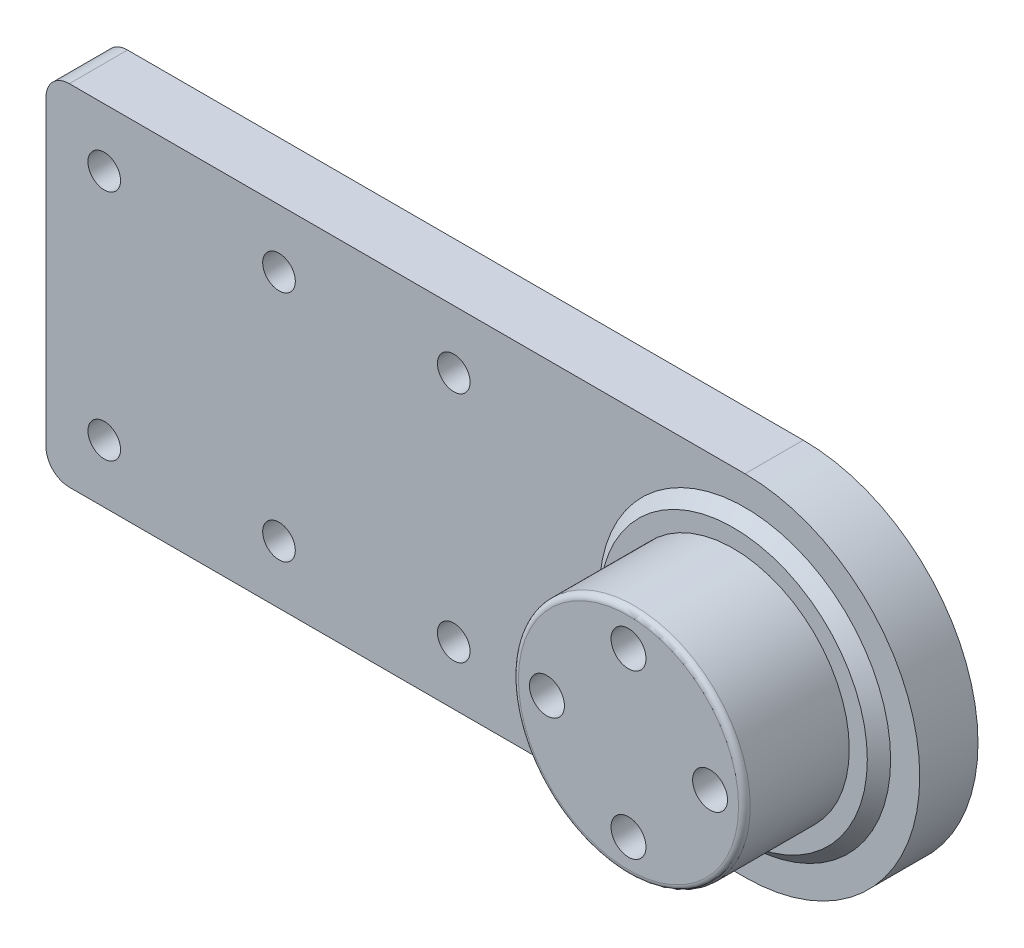
ISO-10303-21;
HEADER;
FILE_DESCRIPTION(('STEP AP214'),'2;1');
FILE_NAME('part.step','',(''),(''),'','','');
FILE_SCHEMA(('AUTOMOTIVE_DESIGN { 1 0 10303 214 1 1 1 1 }'));
ENDSEC;
DATA;
#1=APPLICATION_CONTEXT('core data for automotive mechanical design processes');
#2=APPLICATION_PROTOCOL_DEFINITION('international standard','automotive_design',2000,#1);
#3=PRODUCT_CONTEXT('',#1,'mechanical');
#4=PRODUCT('Part','Part','',(#3));
#5=PRODUCT_RELATED_PRODUCT_CATEGORY('part','',(#4));
#6=PRODUCT_DEFINITION_FORMATION('','',#4);
#7=PRODUCT_DEFINITION_CONTEXT('part definition',#1,'design');
#8=PRODUCT_DEFINITION('design','',#6,#7);
#9=PRODUCT_DEFINITION_SHAPE('','',#8);
#10=(LENGTH_UNIT() NAMED_UNIT(*) SI_UNIT(.MILLI.,.METRE.));
#11=(NAMED_UNIT(*) PLANE_ANGLE_UNIT() SI_UNIT($,.RADIAN.));
#12=(NAMED_UNIT(*) SI_UNIT($,.STERADIAN.) SOLID_ANGLE_UNIT());
#13=UNCERTAINTY_MEASURE_WITH_UNIT(LENGTH_MEASURE(1.E-05),#10,'distance_accuracy_value','');
#14=(GEOMETRIC_REPRESENTATION_CONTEXT(3) GLOBAL_UNCERTAINTY_ASSIGNED_CONTEXT((#13)) GLOBAL_UNIT_ASSIGNED_CONTEXT((#10,
#11,#12)) REPRESENTATION_CONTEXT('',''));
#15=CARTESIAN_POINT('',(0.,0.,0.));
#16=DIRECTION('',(0.,0.,1.));
#17=DIRECTION('',(1.,0.,0.));
#18=AXIS2_PLACEMENT_3D('',#15,#16,#17);
#19=CARTESIAN_POINT('',(0.,0.,0.));
#20=DIRECTION('',(0.,0.,1.));
#21=DIRECTION('',(1.,0.,0.));
#22=AXIS2_PLACEMENT_3D('',#19,#20,#21);
#23=CYLINDRICAL_SURFACE('',#22,9.95);
#24=CARTESIAN_POINT('',(0.,0.,1.5));
#25=DIRECTION('',(0.,0.,1.));
#26=DIRECTION('',(1.,0.,0.));
#27=AXIS2_PLACEMENT_3D('',#24,#25,#26);
#28=CIRCLE('',#27,9.95);
#29=CARTESIAN_POINT('',(9.95,0.,1.5));
#30=VERTEX_POINT('',#29);
#31=EDGE_CURVE('E11',#30,#30,#28,.F.);
#32=ORIENTED_EDGE('',*,*,#31,.T.);
#33=EDGE_LOOP('',(#32));
#34=FACE_BOUND('',#33,.T.);
#35=CARTESIAN_POINT('',(0.,0.,-7.));
#36=DIRECTION('',(0.,0.,1.));
#37=DIRECTION('',(1.,0.,0.));
#38=AXIS2_PLACEMENT_3D('',#35,#36,#37);
#39=CIRCLE('',#38,9.95);
#40=CARTESIAN_POINT('',(9.95,0.,-7.));
#41=VERTEX_POINT('',#40);
#42=EDGE_CURVE('E114',#41,#41,#39,.T.);
#43=ORIENTED_EDGE('',*,*,#42,.T.);
#44=EDGE_LOOP('',(#43));
#45=FACE_BOUND('',#44,.T.);
#46=ADVANCED_FACE('F37',(#34,#45),#23,.T.);
#47=CARTESIAN_POINT('',(0.,0.,-7.));
#48=DIRECTION('',(0.,0.,-1.));
#49=DIRECTION('',(-1.,0.,0.));
#50=AXIS2_PLACEMENT_3D('',#47,#48,#49);
#51=CONICAL_SURFACE('',#50,11.5,0.785398163397449);
#52=CARTESIAN_POINT('',(0.,0.,-8.));
#53=DIRECTION('',(0.,0.,1.));
#54=DIRECTION('',(1.,0.,0.));
#55=AXIS2_PLACEMENT_3D('',#52,#53,#54);
#56=CIRCLE('',#55,12.5);
#57=CARTESIAN_POINT('',(12.5,0.,-8.));
#58=VERTEX_POINT('',#57);
#59=EDGE_CURVE('E110',#58,#58,#56,.T.);
#60=ORIENTED_EDGE('',*,*,#59,.T.);
#61=EDGE_LOOP('',(#60));
#62=FACE_BOUND('',#61,.T.);
#63=CARTESIAN_POINT('',(0.,0.,-7.));
#64=DIRECTION('',(0.,0.,1.));
#65=DIRECTION('',(1.,0.,0.));
#66=AXIS2_PLACEMENT_3D('',#63,#64,#65);
#67=CIRCLE('',#66,11.5);
#68=CARTESIAN_POINT('',(11.5,0.,-7.));
#69=VERTEX_POINT('',#68);
#70=EDGE_CURVE('E121',#69,#69,#67,.T.);
#71=ORIENTED_EDGE('',*,*,#70,.F.);
#72=EDGE_LOOP('',(#71));
#73=FACE_BOUND('',#72,.T.);
#74=ADVANCED_FACE('F155',(#62,#73),#51,.T.);
#75=CARTESIAN_POINT('',(9.95,0.,-7.));
#76=DIRECTION('',(0.,0.,1.));
#77=DIRECTION('',(1.,0.,0.));
#78=AXIS2_PLACEMENT_3D('',#75,#76,#77);
#79=PLANE('',#78);
#80=ORIENTED_EDGE('',*,*,#70,.T.);
#81=EDGE_LOOP('',(#80));
#82=FACE_BOUND('',#81,.T.);
#83=ORIENTED_EDGE('',*,*,#42,.F.);
#84=EDGE_LOOP('',(#83));
#85=FACE_BOUND('',#84,.T.);
#86=ADVANCED_FACE('F163',(#82,#85),#79,.T.);
#87=CARTESIAN_POINT('',(0.,0.,-13.));
#88=DIRECTION('',(0.,0.,1.));
#89=DIRECTION('',(1.,0.,0.));
#90=AXIS2_PLACEMENT_3D('',#87,#88,#89);
#91=CYLINDRICAL_SURFACE('',#90,15.);
#92=CARTESIAN_POINT('',(0.,0.,-8.));
#93=DIRECTION('',(0.,0.,-1.));
#94=DIRECTION('',(-1.,0.,0.));
#95=AXIS2_PLACEMENT_3D('',#92,#93,#94);
#96=CIRCLE('',#95,15.);
#97=CARTESIAN_POINT('',(0.,15.,-8.));
#98=VERTEX_POINT('',#97);
#99=CARTESIAN_POINT('',(0.,-15.,-8.));
#100=VERTEX_POINT('',#99);
#101=EDGE_CURVE('E109',#98,#100,#96,.T.);
#102=ORIENTED_EDGE('',*,*,#101,.T.);
#103=DIRECTION('',(0.,0.,1.));
#104=VECTOR('',#103,1.);
#105=CARTESIAN_POINT('',(0.,-15.,-13.));
#106=LINE('',#105,#104);
#107=CARTESIAN_POINT('',(0.,-15.,-13.));
#108=VERTEX_POINT('',#107);
#109=EDGE_CURVE('E95',#108,#100,#106,.T.);
#110=ORIENTED_EDGE('',*,*,#109,.F.);
#111=CARTESIAN_POINT('',(0.,0.,-13.));
#112=DIRECTION('',(0.,0.,-1.));
#113=DIRECTION('',(-1.,0.,0.));
#114=AXIS2_PLACEMENT_3D('',#111,#112,#113);
#115=CIRCLE('',#114,15.);
#116=CARTESIAN_POINT('',(0.,15.,-13.));
#117=VERTEX_POINT('',#116);
#118=EDGE_CURVE('E99',#117,#108,#115,.T.);
#119=ORIENTED_EDGE('',*,*,#118,.F.);
#120=DIRECTION('',(0.,0.,1.));
#121=VECTOR('',#120,1.);
#122=CARTESIAN_POINT('',(0.,15.,-13.));
#123=LINE('',#122,#121);
#124=EDGE_CURVE('E111',#117,#98,#123,.T.);
#125=ORIENTED_EDGE('',*,*,#124,.T.);
#126=EDGE_LOOP('',(#102,#110,#119,#125));
#127=FACE_BOUND('',#126,.T.);
#128=ADVANCED_FACE('F107',(#127),#91,.T.);
#129=CARTESIAN_POINT('',(-60.,-15.,-13.));
#130=DIRECTION('',(0.,-1.,0.));
#131=DIRECTION('',(0.,0.,-1.));
#132=AXIS2_PLACEMENT_3D('',#129,#130,#131);
#133=PLANE('',#132);
#134=DIRECTION('',(1.,0.,0.));
#135=VECTOR('',#134,1.);
#136=CARTESIAN_POINT('',(-60.,-15.,-8.));
#137=LINE('',#136,#135);
#138=CARTESIAN_POINT('',(-58.,-15.,-8.));
#139=VERTEX_POINT('',#138);
#140=EDGE_CURVE('E189',#139,#100,#137,.T.);
#141=ORIENTED_EDGE('',*,*,#140,.F.);
#142=DIRECTION('',(0.,0.,1.));
#143=VECTOR('',#142,1.);
#144=CARTESIAN_POINT('',(-58.,-15.,-13.));
#145=LINE('',#144,#143);
#146=CARTESIAN_POINT('',(-58.,-15.,-13.));
#147=VERTEX_POINT('',#146);
#148=EDGE_CURVE('E60',#139,#147,#145,.F.);
#149=ORIENTED_EDGE('',*,*,#148,.T.);
#150=DIRECTION('',(1.,0.,0.));
#151=VECTOR('',#150,1.);
#152=CARTESIAN_POINT('',(-60.,-15.,-13.));
#153=LINE('',#152,#151);
#154=EDGE_CURVE('E91',#147,#108,#153,.T.);
#155=ORIENTED_EDGE('',*,*,#154,.T.);
#156=ORIENTED_EDGE('',*,*,#109,.T.);
#157=EDGE_LOOP('',(#141,#149,#155,#156));
#158=FACE_BOUND('',#157,.T.);
#159=ADVANCED_FACE('F93',(#158),#133,.T.);
#160=CARTESIAN_POINT('',(-60.,15.,-13.));
#161=DIRECTION('',(-1.,0.,0.));
#162=DIRECTION('',(0.,0.,1.));
#163=AXIS2_PLACEMENT_3D('',#160,#161,#162);
#164=PLANE('',#163);
#165=DIRECTION('',(0.,-1.,0.));
#166=VECTOR('',#165,1.);
#167=CARTESIAN_POINT('',(-60.,15.,-13.));
#168=LINE('',#167,#166);
#169=CARTESIAN_POINT('',(-60.,13.,-13.));
#170=VERTEX_POINT('',#169);
#171=CARTESIAN_POINT('',(-60.,-13.,-13.));
#172=VERTEX_POINT('',#171);
#173=EDGE_CURVE('E98',#170,#172,#168,.T.);
#174=ORIENTED_EDGE('',*,*,#173,.T.);
#175=DIRECTION('',(0.,0.,1.));
#176=VECTOR('',#175,1.);
#177=CARTESIAN_POINT('',(-60.,-13.,-13.));
#178=LINE('',#177,#176);
#179=CARTESIAN_POINT('',(-60.,-13.,-8.));
#180=VERTEX_POINT('',#179);
#181=EDGE_CURVE('E126',#172,#180,#178,.T.);
#182=ORIENTED_EDGE('',*,*,#181,.T.);
#183=DIRECTION('',(0.,-1.,0.));
#184=VECTOR('',#183,1.);
#185=CARTESIAN_POINT('',(-60.,15.,-8.));
#186=LINE('',#185,#184);
#187=CARTESIAN_POINT('',(-60.,13.,-8.));
#188=VERTEX_POINT('',#187);
#189=EDGE_CURVE('E192',#188,#180,#186,.T.);
#190=ORIENTED_EDGE('',*,*,#189,.F.);
#191=DIRECTION('',(0.,0.,1.));
#192=VECTOR('',#191,1.);
#193=CARTESIAN_POINT('',(-60.,13.,-13.));
#194=LINE('',#193,#192);
#195=EDGE_CURVE('E123',#188,#170,#194,.F.);
#196=ORIENTED_EDGE('',*,*,#195,.T.);
#197=EDGE_LOOP('',(#174,#182,#190,#196));
#198=FACE_BOUND('',#197,.T.);
#199=ADVANCED_FACE('F181',(#198),#164,.T.);
#200=CARTESIAN_POINT('',(0.,15.,-13.));
#201=DIRECTION('',(0.,1.,0.));
#202=DIRECTION('',(0.,0.,1.));
#203=AXIS2_PLACEMENT_3D('',#200,#201,#202);
#204=PLANE('',#203);
#205=DIRECTION('',(-1.,0.,0.));
#206=VECTOR('',#205,1.);
#207=CARTESIAN_POINT('',(0.,15.,-13.));
#208=LINE('',#207,#206);
#209=CARTESIAN_POINT('',(-58.,15.,-13.));
#210=VERTEX_POINT('',#209);
#211=EDGE_CURVE('E103',#117,#210,#208,.T.);
#212=ORIENTED_EDGE('',*,*,#211,.T.);
#213=DIRECTION('',(0.,0.,1.));
#214=VECTOR('',#213,1.);
#215=CARTESIAN_POINT('',(-58.,15.,-13.));
#216=LINE('',#215,#214);
#217=CARTESIAN_POINT('',(-58.,15.,-8.));
#218=VERTEX_POINT('',#217);
#219=EDGE_CURVE('E137',#210,#218,#216,.T.);
#220=ORIENTED_EDGE('',*,*,#219,.T.);
#221=DIRECTION('',(-1.,0.,0.));
#222=VECTOR('',#221,1.);
#223=CARTESIAN_POINT('',(0.,15.,-8.));
#224=LINE('',#223,#222);
#225=EDGE_CURVE('E105',#98,#218,#224,.T.);
#226=ORIENTED_EDGE('',*,*,#225,.F.);
#227=ORIENTED_EDGE('',*,*,#124,.F.);
#228=EDGE_LOOP('',(#212,#220,#226,#227));
#229=FACE_BOUND('',#228,.T.);
#230=ADVANCED_FACE('F198',(#229),#204,.T.);
#231=CARTESIAN_POINT('',(0.,0.,-13.));
#232=DIRECTION('',(0.,0.,-1.));
#233=DIRECTION('',(-1.,0.,0.));
#234=AXIS2_PLACEMENT_3D('',#231,#232,#233);
#235=PLANE('',#234);
#236=CARTESIAN_POINT('',(-25.,10.,-13.));
#237=DIRECTION('',(0.,0.,1.));
#238=DIRECTION('',(1.,0.,0.));
#239=AXIS2_PLACEMENT_3D('',#236,#237,#238);
#240=CIRCLE('',#239,1.4);
#241=CARTESIAN_POINT('',(-23.6,10.,-13.));
#242=VERTEX_POINT('',#241);
#243=EDGE_CURVE('E457',#242,#242,#240,.T.);
#244=ORIENTED_EDGE('',*,*,#243,.T.);
#245=EDGE_LOOP('',(#244));
#246=FACE_BOUND('',#245,.T.);
#247=CARTESIAN_POINT('',(-40.,-10.,-13.));
#248=DIRECTION('',(0.,0.,1.));
#249=DIRECTION('',(1.,0.,0.));
#250=AXIS2_PLACEMENT_3D('',#247,#248,#249);
#251=CIRCLE('',#250,1.4);
#252=CARTESIAN_POINT('',(-38.6,-10.,-13.));
#253=VERTEX_POINT('',#252);
#254=EDGE_CURVE('E439',#253,#253,#251,.T.);
#255=ORIENTED_EDGE('',*,*,#254,.T.);
#256=EDGE_LOOP('',(#255));
#257=FACE_BOUND('',#256,.T.);
#258=CARTESIAN_POINT('',(-40.,10.,-13.));
#259=DIRECTION('',(0.,0.,1.));
#260=DIRECTION('',(1.,0.,0.));
#261=AXIS2_PLACEMENT_3D('',#258,#259,#260);
#262=CIRCLE('',#261,1.4);
#263=CARTESIAN_POINT('',(-38.6,10.,-13.));
#264=VERTEX_POINT('',#263);
#265=EDGE_CURVE('E444',#264,#264,#262,.T.);
#266=ORIENTED_EDGE('',*,*,#265,.T.);
#267=EDGE_LOOP('',(#266));
#268=FACE_BOUND('',#267,.T.);
#269=CARTESIAN_POINT('',(-55.,-10.,-13.));
#270=DIRECTION('',(0.,0.,1.));
#271=DIRECTION('',(1.,0.,0.));
#272=AXIS2_PLACEMENT_3D('',#269,#270,#271);
#273=CIRCLE('',#272,1.4);
#274=CARTESIAN_POINT('',(-53.6,-10.,-13.));
#275=VERTEX_POINT('',#274);
#276=EDGE_CURVE('E465',#275,#275,#273,.T.);
#277=ORIENTED_EDGE('',*,*,#276,.T.);
#278=EDGE_LOOP('',(#277));
#279=FACE_BOUND('',#278,.T.);
#280=CARTESIAN_POINT('',(-25.,-10.,-13.));
#281=DIRECTION('',(0.,0.,1.));
#282=DIRECTION('',(1.,0.,0.));
#283=AXIS2_PLACEMENT_3D('',#280,#281,#282);
#284=CIRCLE('',#283,1.4);
#285=CARTESIAN_POINT('',(-23.6,-10.,-13.));
#286=VERTEX_POINT('',#285);
#287=EDGE_CURVE('E452',#286,#286,#284,.T.);
#288=ORIENTED_EDGE('',*,*,#287,.T.);
#289=EDGE_LOOP('',(#288));
#290=FACE_BOUND('',#289,.T.);
#291=CARTESIAN_POINT('',(-55.,10.,-13.));
#292=DIRECTION('',(0.,0.,1.));
#293=DIRECTION('',(1.,0.,0.));
#294=AXIS2_PLACEMENT_3D('',#291,#292,#293);
#295=CIRCLE('',#294,1.4);
#296=CARTESIAN_POINT('',(-53.6,10.,-13.));
#297=VERTEX_POINT('',#296);
#298=EDGE_CURVE('E470',#297,#297,#295,.T.);
#299=ORIENTED_EDGE('',*,*,#298,.T.);
#300=EDGE_LOOP('',(#299));
#301=FACE_BOUND('',#300,.T.);
#302=CARTESIAN_POINT('',(0.,7.,-13.));
#303=DIRECTION('',(0.,0.,1.));
#304=DIRECTION('',(1.,0.,0.));
#305=AXIS2_PLACEMENT_3D('',#302,#303,#304);
#306=CIRCLE('',#305,1.5);
#307=CARTESIAN_POINT('',(1.5,7.,-13.));
#308=VERTEX_POINT('',#307);
#309=EDGE_CURVE('E190',#308,#308,#306,.T.);
#310=ORIENTED_EDGE('',*,*,#309,.T.);
#311=EDGE_LOOP('',(#310));
#312=FACE_BOUND('',#311,.T.);
#313=CARTESIAN_POINT('',(7.,0.,-13.));
#314=DIRECTION('',(0.,0.,1.));
#315=DIRECTION('',(1.,0.,0.));
#316=AXIS2_PLACEMENT_3D('',#313,#314,#315);
#317=CIRCLE('',#316,1.5);
#318=CARTESIAN_POINT('',(8.5,0.,-13.));
#319=VERTEX_POINT('',#318);
#320=EDGE_CURVE('E484',#319,#319,#317,.T.);
#321=ORIENTED_EDGE('',*,*,#320,.T.);
#322=EDGE_LOOP('',(#321));
#323=FACE_BOUND('',#322,.T.);
#324=CARTESIAN_POINT('',(0.,-7.,-13.));
#325=DIRECTION('',(0.,0.,1.));
#326=DIRECTION('',(1.,0.,0.));
#327=AXIS2_PLACEMENT_3D('',#324,#325,#326);
#328=CIRCLE('',#327,1.5);
#329=CARTESIAN_POINT('',(1.5,-7.,-13.));
#330=VERTEX_POINT('',#329);
#331=EDGE_CURVE('E490',#330,#330,#328,.T.);
#332=ORIENTED_EDGE('',*,*,#331,.T.);
#333=EDGE_LOOP('',(#332));
#334=FACE_BOUND('',#333,.T.);
#335=CARTESIAN_POINT('',(-7.,0.,-13.));
#336=DIRECTION('',(0.,0.,1.));
#337=DIRECTION('',(1.,0.,0.));
#338=AXIS2_PLACEMENT_3D('',#335,#336,#337);
#339=CIRCLE('',#338,1.5);
#340=CARTESIAN_POINT('',(-5.5,0.,-13.));
#341=VERTEX_POINT('',#340);
#342=EDGE_CURVE('E473',#341,#341,#339,.T.);
#343=ORIENTED_EDGE('',*,*,#342,.T.);
#344=EDGE_LOOP('',(#343));
#345=FACE_BOUND('',#344,.T.);
#346=ORIENTED_EDGE('',*,*,#154,.F.);
#347=CARTESIAN_POINT('',(-58.,-13.,-13.));
#348=DIRECTION('',(0.,0.,-1.));
#349=DIRECTION('',(-1.,0.,0.));
#350=AXIS2_PLACEMENT_3D('',#347,#348,#349);
#351=CIRCLE('',#350,2.);
#352=EDGE_CURVE('E135',#147,#172,#351,.T.);
#353=ORIENTED_EDGE('',*,*,#352,.T.);
#354=ORIENTED_EDGE('',*,*,#173,.F.);
#355=CARTESIAN_POINT('',(-58.,13.,-13.));
#356=DIRECTION('',(0.,0.,-1.));
#357=DIRECTION('',(-1.,0.,0.));
#358=AXIS2_PLACEMENT_3D('',#355,#356,#357);
#359=CIRCLE('',#358,2.);
#360=EDGE_CURVE('E52',#170,#210,#359,.T.);
#361=ORIENTED_EDGE('',*,*,#360,.T.);
#362=ORIENTED_EDGE('',*,*,#211,.F.);
#363=ORIENTED_EDGE('',*,*,#118,.T.);
#364=EDGE_LOOP('',(#346,#353,#354,#361,#362,#363));
#365=FACE_BOUND('',#364,.T.);
#366=ADVANCED_FACE('F102',(#246,#257,#268,#279,#290,#301,#312,#323,#334,#345,#365),#235,.T.);
#367=CARTESIAN_POINT('',(0.,0.,-8.));
#368=DIRECTION('',(0.,0.,-1.));
#369=DIRECTION('',(-1.,0.,0.));
#370=AXIS2_PLACEMENT_3D('',#367,#368,#369);
#371=PLANE('',#370);
#372=CARTESIAN_POINT('',(-25.,10.,-8.));
#373=DIRECTION('',(0.,0.,1.));
#374=DIRECTION('',(1.,0.,0.));
#375=AXIS2_PLACEMENT_3D('',#372,#373,#374);
#376=CIRCLE('',#375,1.4);
#377=CARTESIAN_POINT('',(-23.6,10.,-8.));
#378=VERTEX_POINT('',#377);
#379=EDGE_CURVE('E449',#378,#378,#376,.T.);
#380=ORIENTED_EDGE('',*,*,#379,.F.);
#381=EDGE_LOOP('',(#380));
#382=FACE_BOUND('',#381,.T.);
#383=CARTESIAN_POINT('',(-40.,-10.,-8.));
#384=DIRECTION('',(0.,0.,1.));
#385=DIRECTION('',(1.,0.,0.));
#386=AXIS2_PLACEMENT_3D('',#383,#384,#385);
#387=CIRCLE('',#386,1.4);
#388=CARTESIAN_POINT('',(-38.6,-10.,-8.));
#389=VERTEX_POINT('',#388);
#390=EDGE_CURVE('E442',#389,#389,#387,.T.);
#391=ORIENTED_EDGE('',*,*,#390,.F.);
#392=EDGE_LOOP('',(#391));
#393=FACE_BOUND('',#392,.T.);
#394=CARTESIAN_POINT('',(-40.,10.,-8.));
#395=DIRECTION('',(0.,0.,1.));
#396=DIRECTION('',(1.,0.,0.));
#397=AXIS2_PLACEMENT_3D('',#394,#395,#396);
#398=CIRCLE('',#397,1.4);
#399=CARTESIAN_POINT('',(-38.6,10.,-8.));
#400=VERTEX_POINT('',#399);
#401=EDGE_CURVE('E447',#400,#400,#398,.T.);
#402=ORIENTED_EDGE('',*,*,#401,.F.);
#403=EDGE_LOOP('',(#402));
#404=FACE_BOUND('',#403,.T.);
#405=CARTESIAN_POINT('',(-55.,-10.,-8.));
#406=DIRECTION('',(0.,0.,1.));
#407=DIRECTION('',(1.,0.,0.));
#408=AXIS2_PLACEMENT_3D('',#405,#406,#407);
#409=CIRCLE('',#408,1.4);
#410=CARTESIAN_POINT('',(-53.6,-10.,-8.));
#411=VERTEX_POINT('',#410);
#412=EDGE_CURVE('E461',#411,#411,#409,.T.);
#413=ORIENTED_EDGE('',*,*,#412,.F.);
#414=EDGE_LOOP('',(#413));
#415=FACE_BOUND('',#414,.T.);
#416=CARTESIAN_POINT('',(-25.,-10.,-8.));
#417=DIRECTION('',(0.,0.,1.));
#418=DIRECTION('',(1.,0.,0.));
#419=AXIS2_PLACEMENT_3D('',#416,#417,#418);
#420=CIRCLE('',#419,1.4);
#421=CARTESIAN_POINT('',(-23.6,-10.,-8.));
#422=VERTEX_POINT('',#421);
#423=EDGE_CURVE('E460',#422,#422,#420,.T.);
#424=ORIENTED_EDGE('',*,*,#423,.F.);
#425=EDGE_LOOP('',(#424));
#426=FACE_BOUND('',#425,.T.);
#427=CARTESIAN_POINT('',(-55.,10.,-8.));
#428=DIRECTION('',(0.,0.,1.));
#429=DIRECTION('',(1.,0.,0.));
#430=AXIS2_PLACEMENT_3D('',#427,#428,#429);
#431=CIRCLE('',#430,1.4);
#432=CARTESIAN_POINT('',(-53.6,10.,-8.));
#433=VERTEX_POINT('',#432);
#434=EDGE_CURVE('E464',#433,#433,#431,.T.);
#435=ORIENTED_EDGE('',*,*,#434,.F.);
#436=EDGE_LOOP('',(#435));
#437=FACE_BOUND('',#436,.T.);
#438=ORIENTED_EDGE('',*,*,#59,.F.);
#439=EDGE_LOOP('',(#438));
#440=FACE_BOUND('',#439,.T.);
#441=ORIENTED_EDGE('',*,*,#189,.T.);
#442=CARTESIAN_POINT('',(-58.,-13.,-8.));
#443=DIRECTION('',(0.,0.,-1.));
#444=DIRECTION('',(-1.,0.,0.));
#445=AXIS2_PLACEMENT_3D('',#442,#443,#444);
#446=CIRCLE('',#445,2.);
#447=EDGE_CURVE('E131',#180,#139,#446,.F.);
#448=ORIENTED_EDGE('',*,*,#447,.T.);
#449=ORIENTED_EDGE('',*,*,#140,.T.);
#450=ORIENTED_EDGE('',*,*,#101,.F.);
#451=ORIENTED_EDGE('',*,*,#225,.T.);
#452=CARTESIAN_POINT('',(-58.,13.,-8.));
#453=DIRECTION('',(0.,0.,-1.));
#454=DIRECTION('',(-1.,0.,0.));
#455=AXIS2_PLACEMENT_3D('',#452,#453,#454);
#456=CIRCLE('',#455,2.);
#457=EDGE_CURVE('E129',#218,#188,#456,.F.);
#458=ORIENTED_EDGE('',*,*,#457,.T.);
#459=EDGE_LOOP('',(#441,#448,#449,#450,#451,#458));
#460=FACE_BOUND('',#459,.T.);
#461=ADVANCED_FACE('F196',(#382,#393,#404,#415,#426,#437,#440,#460),#371,.F.);
#462=CARTESIAN_POINT('',(0.,0.,2.));
#463=DIRECTION('',(0.,0.,1.));
#464=DIRECTION('',(1.,0.,0.));
#465=AXIS2_PLACEMENT_3D('',#462,#463,#464);
#466=PLANE('',#465);
#467=CARTESIAN_POINT('',(0.,0.,2.));
#468=DIRECTION('',(0.,0.,1.));
#469=DIRECTION('',(1.,0.,0.));
#470=AXIS2_PLACEMENT_3D('',#467,#468,#469);
#471=CIRCLE('',#470,9.45);
#472=CARTESIAN_POINT('',(9.45,0.,2.));
#473=VERTEX_POINT('',#472);
#474=EDGE_CURVE('E45',#473,#473,#471,.T.);
#475=ORIENTED_EDGE('',*,*,#474,.T.);
#476=EDGE_LOOP('',(#475));
#477=FACE_BOUND('',#476,.T.);
#478=CARTESIAN_POINT('',(0.,7.,2.));
#479=DIRECTION('',(0.,0.,1.));
#480=DIRECTION('',(1.,0.,0.));
#481=AXIS2_PLACEMENT_3D('',#478,#479,#480);
#482=CIRCLE('',#481,1.5);
#483=CARTESIAN_POINT('',(1.5,7.,2.));
#484=VERTEX_POINT('',#483);
#485=EDGE_CURVE('E478',#484,#484,#482,.T.);
#486=ORIENTED_EDGE('',*,*,#485,.F.);
#487=EDGE_LOOP('',(#486));
#488=FACE_BOUND('',#487,.T.);
#489=CARTESIAN_POINT('',(7.,0.,2.));
#490=DIRECTION('',(0.,0.,1.));
#491=DIRECTION('',(1.,0.,0.));
#492=AXIS2_PLACEMENT_3D('',#489,#490,#491);
#493=CIRCLE('',#492,1.5);
#494=CARTESIAN_POINT('',(8.5,0.,2.));
#495=VERTEX_POINT('',#494);
#496=EDGE_CURVE('E481',#495,#495,#493,.T.);
#497=ORIENTED_EDGE('',*,*,#496,.F.);
#498=EDGE_LOOP('',(#497));
#499=FACE_BOUND('',#498,.T.);
#500=CARTESIAN_POINT('',(0.,-7.,2.));
#501=DIRECTION('',(0.,0.,1.));
#502=DIRECTION('',(1.,0.,0.));
#503=AXIS2_PLACEMENT_3D('',#500,#501,#502);
#504=CIRCLE('',#503,1.5);
#505=CARTESIAN_POINT('',(1.5,-7.,2.));
#506=VERTEX_POINT('',#505);
#507=EDGE_CURVE('E487',#506,#506,#504,.T.);
#508=ORIENTED_EDGE('',*,*,#507,.F.);
#509=EDGE_LOOP('',(#508));
#510=FACE_BOUND('',#509,.T.);
#511=CARTESIAN_POINT('',(-7.,0.,2.));
#512=DIRECTION('',(0.,0.,1.));
#513=DIRECTION('',(1.,0.,0.));
#514=AXIS2_PLACEMENT_3D('',#511,#512,#513);
#515=CIRCLE('',#514,1.5);
#516=CARTESIAN_POINT('',(-5.5,0.,2.));
#517=VERTEX_POINT('',#516);
#518=EDGE_CURVE('E493',#517,#517,#515,.T.);
#519=ORIENTED_EDGE('',*,*,#518,.F.);
#520=EDGE_LOOP('',(#519));
#521=FACE_BOUND('',#520,.T.);
#522=ADVANCED_FACE('F142',(#477,#488,#499,#510,#521),#466,.T.);
#523=CARTESIAN_POINT('',(-7.,0.,-13.));
#524=DIRECTION('',(0.,0.,1.));
#525=DIRECTION('',(1.,0.,0.));
#526=AXIS2_PLACEMENT_3D('',#523,#524,#525);
#527=CYLINDRICAL_SURFACE('',#526,1.5);
#528=CARTESIAN_POINT('',(-5.5,0.,-13.));
#529=CARTESIAN_POINT('',(-5.5,0.,-12.84375));
#530=CARTESIAN_POINT('',(-5.5,0.,-12.6875));
#531=CARTESIAN_POINT('',(-5.5,0.,-12.375));
#532=CARTESIAN_POINT('',(-5.5,0.,-12.21875));
#533=CARTESIAN_POINT('',(-5.5,0.,-11.90625));
#534=CARTESIAN_POINT('',(-5.5,0.,-11.75));
#535=CARTESIAN_POINT('',(-5.5,0.,-11.4375));
#536=CARTESIAN_POINT('',(-5.5,0.,-11.28125));
#537=CARTESIAN_POINT('',(-5.5,0.,-10.96875));
#538=CARTESIAN_POINT('',(-5.5,0.,-10.8125));
#539=CARTESIAN_POINT('',(-5.5,0.,-10.5));
#540=CARTESIAN_POINT('',(-5.5,0.,-10.34375));
#541=CARTESIAN_POINT('',(-5.5,0.,-10.03125));
#542=CARTESIAN_POINT('',(-5.5,0.,-9.875));
#543=CARTESIAN_POINT('',(-5.5,0.,-9.5625));
#544=CARTESIAN_POINT('',(-5.5,0.,-9.40625));
#545=CARTESIAN_POINT('',(-5.5,0.,-9.09375));
#546=CARTESIAN_POINT('',(-5.5,0.,-8.9375));
#547=CARTESIAN_POINT('',(-5.5,0.,-8.625));
#548=CARTESIAN_POINT('',(-5.5,0.,-8.46875));
#549=CARTESIAN_POINT('',(-5.5,0.,-8.15625));
#550=CARTESIAN_POINT('',(-5.5,0.,-8.));
#551=CARTESIAN_POINT('',(-5.5,0.,-7.6875));
#552=CARTESIAN_POINT('',(-5.5,0.,-7.53125));
#553=CARTESIAN_POINT('',(-5.5,0.,-7.21875));
#554=CARTESIAN_POINT('',(-5.5,0.,-7.0625));
#555=CARTESIAN_POINT('',(-5.5,0.,-6.75));
#556=CARTESIAN_POINT('',(-5.5,0.,-6.59375));
#557=CARTESIAN_POINT('',(-5.5,0.,-6.28125));
#558=CARTESIAN_POINT('',(-5.5,0.,-6.125));
#559=CARTESIAN_POINT('',(-5.5,0.,-5.8125));
#560=CARTESIAN_POINT('',(-5.5,0.,-5.65625));
#561=CARTESIAN_POINT('',(-5.5,0.,-5.34375));
#562=CARTESIAN_POINT('',(-5.5,0.,-5.1875));
#563=CARTESIAN_POINT('',(-5.5,0.,-4.875));
#564=CARTESIAN_POINT('',(-5.5,0.,-4.71875));
#565=CARTESIAN_POINT('',(-5.5,0.,-4.40625));
#566=CARTESIAN_POINT('',(-5.5,0.,-4.25));
#567=CARTESIAN_POINT('',(-5.5,0.,-3.9375));
#568=CARTESIAN_POINT('',(-5.5,0.,-3.78125));
#569=CARTESIAN_POINT('',(-5.5,0.,-3.46875));
#570=CARTESIAN_POINT('',(-5.5,0.,-3.3125));
#571=CARTESIAN_POINT('',(-5.5,0.,-3.));
#572=CARTESIAN_POINT('',(-5.5,0.,-2.84375));
#573=CARTESIAN_POINT('',(-5.5,0.,-2.53125));
#574=CARTESIAN_POINT('',(-5.5,0.,-2.375));
#575=CARTESIAN_POINT('',(-5.5,0.,-2.0625));
#576=CARTESIAN_POINT('',(-5.5,0.,-1.90625));
#577=CARTESIAN_POINT('',(-5.5,0.,-1.59375));
#578=CARTESIAN_POINT('',(-5.5,0.,-1.4375));
#579=CARTESIAN_POINT('',(-5.5,0.,-1.125));
#580=CARTESIAN_POINT('',(-5.5,0.,-0.968750000000001));
#581=CARTESIAN_POINT('',(-5.5,0.,-0.656250000000001));
#582=CARTESIAN_POINT('',(-5.5,0.,-0.5));
#583=CARTESIAN_POINT('',(-5.5,0.,-0.1875));
#584=CARTESIAN_POINT('',(-5.5,0.,-0.03125));
#585=CARTESIAN_POINT('',(-5.5,0.,0.28125));
#586=CARTESIAN_POINT('',(-5.5,0.,0.437499999999999));
#587=CARTESIAN_POINT('',(-5.5,0.,0.749999999999999));
#588=CARTESIAN_POINT('',(-5.5,0.,0.906249999999999));
#589=CARTESIAN_POINT('',(-5.5,0.,1.21875));
#590=CARTESIAN_POINT('',(-5.5,0.,1.375));
#591=CARTESIAN_POINT('',(-5.5,0.,1.6875));
#592=CARTESIAN_POINT('',(-5.5,0.,1.84375));
#593=CARTESIAN_POINT('',(-5.5,0.,2.));
#594=B_SPLINE_CURVE_WITH_KNOTS('',3,(#528,#529,#530,#531,#532,#533,#534,#535,#536,#537,#538,
#539,#540,#541,#542,#543,#544,#545,#546,#547,#548,#549,#550,#551,#552,#553,#554,#555,#556,#557,
#558,#559,#560,#561,#562,#563,#564,#565,#566,#567,#568,#569,#570,#571,#572,#573,#574,#575,#576,
#577,#578,#579,#580,#581,#582,#583,#584,#585,#586,#587,#588,#589,#590,#591,#592,#593),
.UNSPECIFIED.,.F.,.F.,(4,2,2,2,2,2,2,2,2,2,2,2,2,2,2,2,2,2,2,2,2,2,2,2,2,2,2,2,2,2,2,2,4),(0.,
0.46875,0.937500000000001,1.40625,1.875,2.34375,2.8125,3.28125,3.75,4.21875,4.6875,5.15625,
5.625,6.09375,6.5625,7.03125,7.5,7.96875,8.4375,8.90625,9.375,9.84375,10.3125,10.78125,11.25,
11.71875,12.1875,12.65625,13.125,13.59375,14.0625,14.53125,15.),.UNSPECIFIED.);
#595=EDGE_CURVE('BSEAM286',#341,#517,#594,.T.);
#596=ORIENTED_EDGE('',*,*,#342,.F.);
#597=ORIENTED_EDGE('',*,*,#518,.T.);
#598=ORIENTED_EDGE('',*,*,#595,.T.);
#599=ORIENTED_EDGE('',*,*,#595,.F.);
#600=EDGE_LOOP('',(#596,#598,#597,#599));
#601=FACE_BOUND('',#600,.T.);
#602=ADVANCED_FACE('F286',(#601),#527,.F.);
#603=CARTESIAN_POINT('',(0.,-7.,-13.));
#604=DIRECTION('',(0.,0.,1.));
#605=DIRECTION('',(1.,0.,0.));
#606=AXIS2_PLACEMENT_3D('',#603,#604,#605);
#607=CYLINDRICAL_SURFACE('',#606,1.5);
#608=CARTESIAN_POINT('',(1.5,-7.,-13.));
#609=CARTESIAN_POINT('',(1.5,-7.,-12.84375));
#610=CARTESIAN_POINT('',(1.5,-7.,-12.6875));
#611=CARTESIAN_POINT('',(1.5,-7.,-12.375));
#612=CARTESIAN_POINT('',(1.5,-7.,-12.21875));
#613=CARTESIAN_POINT('',(1.5,-7.,-11.90625));
#614=CARTESIAN_POINT('',(1.5,-7.,-11.75));
#615=CARTESIAN_POINT('',(1.5,-7.,-11.4375));
#616=CARTESIAN_POINT('',(1.5,-7.,-11.28125));
#617=CARTESIAN_POINT('',(1.5,-7.,-10.96875));
#618=CARTESIAN_POINT('',(1.5,-7.,-10.8125));
#619=CARTESIAN_POINT('',(1.5,-7.,-10.5));
#620=CARTESIAN_POINT('',(1.5,-7.,-10.34375));
#621=CARTESIAN_POINT('',(1.5,-7.,-10.03125));
#622=CARTESIAN_POINT('',(1.5,-7.,-9.875));
#623=CARTESIAN_POINT('',(1.5,-7.,-9.5625));
#624=CARTESIAN_POINT('',(1.5,-7.,-9.40625));
#625=CARTESIAN_POINT('',(1.5,-7.,-9.09375));
#626=CARTESIAN_POINT('',(1.5,-7.,-8.9375));
#627=CARTESIAN_POINT('',(1.5,-7.,-8.625));
#628=CARTESIAN_POINT('',(1.5,-7.,-8.46875));
#629=CARTESIAN_POINT('',(1.5,-7.,-8.15625));
#630=CARTESIAN_POINT('',(1.5,-7.,-8.));
#631=CARTESIAN_POINT('',(1.5,-7.,-7.6875));
#632=CARTESIAN_POINT('',(1.5,-7.,-7.53125));
#633=CARTESIAN_POINT('',(1.5,-7.,-7.21875));
#634=CARTESIAN_POINT('',(1.5,-7.,-7.0625));
#635=CARTESIAN_POINT('',(1.5,-7.,-6.75));
#636=CARTESIAN_POINT('',(1.5,-7.,-6.59375));
#637=CARTESIAN_POINT('',(1.5,-7.,-6.28125));
#638=CARTESIAN_POINT('',(1.5,-7.,-6.125));
#639=CARTESIAN_POINT('',(1.5,-7.,-5.8125));
#640=CARTESIAN_POINT('',(1.5,-7.,-5.65625));
#641=CARTESIAN_POINT('',(1.5,-7.,-5.34375));
#642=CARTESIAN_POINT('',(1.5,-7.,-5.1875));
#643=CARTESIAN_POINT('',(1.5,-7.,-4.875));
#644=CARTESIAN_POINT('',(1.5,-7.,-4.71875));
#645=CARTESIAN_POINT('',(1.5,-7.,-4.40625));
#646=CARTESIAN_POINT('',(1.5,-7.,-4.25));
#647=CARTESIAN_POINT('',(1.5,-7.,-3.9375));
#648=CARTESIAN_POINT('',(1.5,-7.,-3.78125));
#649=CARTESIAN_POINT('',(1.5,-7.,-3.46875));
#650=CARTESIAN_POINT('',(1.5,-7.,-3.3125));
#651=CARTESIAN_POINT('',(1.5,-7.,-3.));
#652=CARTESIAN_POINT('',(1.5,-7.,-2.84375));
#653=CARTESIAN_POINT('',(1.5,-7.,-2.53125));
#654=CARTESIAN_POINT('',(1.5,-7.,-2.375));
#655=CARTESIAN_POINT('',(1.5,-7.,-2.0625));
#656=CARTESIAN_POINT('',(1.5,-7.,-1.90625));
#657=CARTESIAN_POINT('',(1.5,-7.,-1.59375));
#658=CARTESIAN_POINT('',(1.5,-7.,-1.4375));
#659=CARTESIAN_POINT('',(1.5,-7.,-1.125));
#660=CARTESIAN_POINT('',(1.5,-7.,-0.968750000000001));
#661=CARTESIAN_POINT('',(1.5,-7.,-0.656250000000001));
#662=CARTESIAN_POINT('',(1.5,-7.,-0.5));
#663=CARTESIAN_POINT('',(1.5,-7.,-0.1875));
#664=CARTESIAN_POINT('',(1.5,-7.,-0.03125));
#665=CARTESIAN_POINT('',(1.5,-7.,0.28125));
#666=CARTESIAN_POINT('',(1.5,-7.,0.437499999999999));
#667=CARTESIAN_POINT('',(1.5,-7.,0.749999999999999));
#668=CARTESIAN_POINT('',(1.5,-7.,0.906249999999999));
#669=CARTESIAN_POINT('',(1.5,-7.,1.21875));
#670=CARTESIAN_POINT('',(1.5,-7.,1.375));
#671=CARTESIAN_POINT('',(1.5,-7.,1.6875));
#672=CARTESIAN_POINT('',(1.5,-7.,1.84375));
#673=CARTESIAN_POINT('',(1.5,-7.,2.));
#674=B_SPLINE_CURVE_WITH_KNOTS('',3,(#608,#609,#610,#611,#612,#613,#614,#615,#616,#617,#618,
#619,#620,#621,#622,#623,#624,#625,#626,#627,#628,#629,#630,#631,#632,#633,#634,#635,#636,#637,
#638,#639,#640,#641,#642,#643,#644,#645,#646,#647,#648,#649,#650,#651,#652,#653,#654,#655,#656,
#657,#658,#659,#660,#661,#662,#663,#664,#665,#666,#667,#668,#669,#670,#671,#672,#673),
.UNSPECIFIED.,.F.,.F.,(4,2,2,2,2,2,2,2,2,2,2,2,2,2,2,2,2,2,2,2,2,2,2,2,2,2,2,2,2,2,2,2,4),(0.,
0.46875,0.937500000000001,1.40625,1.875,2.34375,2.8125,3.28125,3.75,4.21875,4.6875,5.15625,
5.625,6.09375,6.5625,7.03125,7.5,7.96875,8.4375,8.90625,9.375,9.84375,10.3125,10.78125,11.25,
11.71875,12.1875,12.65625,13.125,13.59375,14.0625,14.53125,15.),.UNSPECIFIED.);
#675=EDGE_CURVE('BSEAM297',#330,#506,#674,.T.);
#676=ORIENTED_EDGE('',*,*,#331,.F.);
#677=ORIENTED_EDGE('',*,*,#507,.T.);
#678=ORIENTED_EDGE('',*,*,#675,.T.);
#679=ORIENTED_EDGE('',*,*,#675,.F.);
#680=EDGE_LOOP('',(#676,#678,#677,#679));
#681=FACE_BOUND('',#680,.T.);
#682=ADVANCED_FACE('F297',(#681),#607,.F.);
#683=CARTESIAN_POINT('',(7.,0.,-13.));
#684=DIRECTION('',(0.,0.,1.));
#685=DIRECTION('',(1.,0.,0.));
#686=AXIS2_PLACEMENT_3D('',#683,#684,#685);
#687=CYLINDRICAL_SURFACE('',#686,1.5);
#688=CARTESIAN_POINT('',(8.5,0.,-13.));
#689=CARTESIAN_POINT('',(8.5,0.,-12.84375));
#690=CARTESIAN_POINT('',(8.5,0.,-12.6875));
#691=CARTESIAN_POINT('',(8.5,0.,-12.375));
#692=CARTESIAN_POINT('',(8.5,0.,-12.21875));
#693=CARTESIAN_POINT('',(8.5,0.,-11.90625));
#694=CARTESIAN_POINT('',(8.5,0.,-11.75));
#695=CARTESIAN_POINT('',(8.5,0.,-11.4375));
#696=CARTESIAN_POINT('',(8.5,0.,-11.28125));
#697=CARTESIAN_POINT('',(8.5,0.,-10.96875));
#698=CARTESIAN_POINT('',(8.5,0.,-10.8125));
#699=CARTESIAN_POINT('',(8.5,0.,-10.5));
#700=CARTESIAN_POINT('',(8.5,0.,-10.34375));
#701=CARTESIAN_POINT('',(8.5,0.,-10.03125));
#702=CARTESIAN_POINT('',(8.5,0.,-9.875));
#703=CARTESIAN_POINT('',(8.5,0.,-9.5625));
#704=CARTESIAN_POINT('',(8.5,0.,-9.40625));
#705=CARTESIAN_POINT('',(8.5,0.,-9.09375));
#706=CARTESIAN_POINT('',(8.5,0.,-8.9375));
#707=CARTESIAN_POINT('',(8.5,0.,-8.625));
#708=CARTESIAN_POINT('',(8.5,0.,-8.46875));
#709=CARTESIAN_POINT('',(8.5,0.,-8.15625));
#710=CARTESIAN_POINT('',(8.5,0.,-8.));
#711=CARTESIAN_POINT('',(8.5,0.,-7.6875));
#712=CARTESIAN_POINT('',(8.5,0.,-7.53125));
#713=CARTESIAN_POINT('',(8.5,0.,-7.21875));
#714=CARTESIAN_POINT('',(8.5,0.,-7.0625));
#715=CARTESIAN_POINT('',(8.5,0.,-6.75));
#716=CARTESIAN_POINT('',(8.5,0.,-6.59375));
#717=CARTESIAN_POINT('',(8.5,0.,-6.28125));
#718=CARTESIAN_POINT('',(8.5,0.,-6.125));
#719=CARTESIAN_POINT('',(8.5,0.,-5.8125));
#720=CARTESIAN_POINT('',(8.5,0.,-5.65625));
#721=CARTESIAN_POINT('',(8.5,0.,-5.34375));
#722=CARTESIAN_POINT('',(8.5,0.,-5.1875));
#723=CARTESIAN_POINT('',(8.5,0.,-4.875));
#724=CARTESIAN_POINT('',(8.5,0.,-4.71875));
#725=CARTESIAN_POINT('',(8.5,0.,-4.40625));
#726=CARTESIAN_POINT('',(8.5,0.,-4.25));
#727=CARTESIAN_POINT('',(8.5,0.,-3.9375));
#728=CARTESIAN_POINT('',(8.5,0.,-3.78125));
#729=CARTESIAN_POINT('',(8.5,0.,-3.46875));
#730=CARTESIAN_POINT('',(8.5,0.,-3.3125));
#731=CARTESIAN_POINT('',(8.5,0.,-3.));
#732=CARTESIAN_POINT('',(8.5,0.,-2.84375));
#733=CARTESIAN_POINT('',(8.5,0.,-2.53125));
#734=CARTESIAN_POINT('',(8.5,0.,-2.375));
#735=CARTESIAN_POINT('',(8.5,0.,-2.0625));
#736=CARTESIAN_POINT('',(8.5,0.,-1.90625));
#737=CARTESIAN_POINT('',(8.5,0.,-1.59375));
#738=CARTESIAN_POINT('',(8.5,0.,-1.4375));
#739=CARTESIAN_POINT('',(8.5,0.,-1.125));
#740=CARTESIAN_POINT('',(8.5,0.,-0.968750000000001));
#741=CARTESIAN_POINT('',(8.5,0.,-0.656250000000001));
#742=CARTESIAN_POINT('',(8.5,0.,-0.5));
#743=CARTESIAN_POINT('',(8.5,0.,-0.1875));
#744=CARTESIAN_POINT('',(8.5,0.,-0.03125));
#745=CARTESIAN_POINT('',(8.5,0.,0.28125));
#746=CARTESIAN_POINT('',(8.5,0.,0.437499999999999));
#747=CARTESIAN_POINT('',(8.5,0.,0.749999999999999));
#748=CARTESIAN_POINT('',(8.5,0.,0.906249999999999));
#749=CARTESIAN_POINT('',(8.5,0.,1.21875));
#750=CARTESIAN_POINT('',(8.5,0.,1.375));
#751=CARTESIAN_POINT('',(8.5,0.,1.6875));
#752=CARTESIAN_POINT('',(8.5,0.,1.84375));
#753=CARTESIAN_POINT('',(8.5,0.,2.));
#754=B_SPLINE_CURVE_WITH_KNOTS('',3,(#688,#689,#690,#691,#692,#693,#694,#695,#696,#697,#698,
#699,#700,#701,#702,#703,#704,#705,#706,#707,#708,#709,#710,#711,#712,#713,#714,#715,#716,#717,
#718,#719,#720,#721,#722,#723,#724,#725,#726,#727,#728,#729,#730,#731,#732,#733,#734,#735,#736,
#737,#738,#739,#740,#741,#742,#743,#744,#745,#746,#747,#748,#749,#750,#751,#752,#753),
.UNSPECIFIED.,.F.,.F.,(4,2,2,2,2,2,2,2,2,2,2,2,2,2,2,2,2,2,2,2,2,2,2,2,2,2,2,2,2,2,2,2,4),(0.,
0.46875,0.937500000000001,1.40625,1.875,2.34375,2.8125,3.28125,3.75,4.21875,4.6875,5.15625,
5.625,6.09375,6.5625,7.03125,7.5,7.96875,8.4375,8.90625,9.375,9.84375,10.3125,10.78125,11.25,
11.71875,12.1875,12.65625,13.125,13.59375,14.0625,14.53125,15.),.UNSPECIFIED.);
#755=EDGE_CURVE('BSEAM304',#319,#495,#754,.T.);
#756=ORIENTED_EDGE('',*,*,#320,.F.);
#757=ORIENTED_EDGE('',*,*,#496,.T.);
#758=ORIENTED_EDGE('',*,*,#755,.T.);
#759=ORIENTED_EDGE('',*,*,#755,.F.);
#760=EDGE_LOOP('',(#756,#758,#757,#759));
#761=FACE_BOUND('',#760,.T.);
#762=ADVANCED_FACE('F304',(#761),#687,.F.);
#763=CARTESIAN_POINT('',(0.,7.,-13.));
#764=DIRECTION('',(0.,0.,1.));
#765=DIRECTION('',(1.,0.,0.));
#766=AXIS2_PLACEMENT_3D('',#763,#764,#765);
#767=CYLINDRICAL_SURFACE('',#766,1.5);
#768=CARTESIAN_POINT('',(1.5,7.,-13.));
#769=CARTESIAN_POINT('',(1.5,7.,-12.84375));
#770=CARTESIAN_POINT('',(1.5,7.,-12.6875));
#771=CARTESIAN_POINT('',(1.5,7.,-12.375));
#772=CARTESIAN_POINT('',(1.5,7.,-12.21875));
#773=CARTESIAN_POINT('',(1.5,7.,-11.90625));
#774=CARTESIAN_POINT('',(1.5,7.,-11.75));
#775=CARTESIAN_POINT('',(1.5,7.,-11.4375));
#776=CARTESIAN_POINT('',(1.5,7.,-11.28125));
#777=CARTESIAN_POINT('',(1.5,7.,-10.96875));
#778=CARTESIAN_POINT('',(1.5,7.,-10.8125));
#779=CARTESIAN_POINT('',(1.5,7.,-10.5));
#780=CARTESIAN_POINT('',(1.5,7.,-10.34375));
#781=CARTESIAN_POINT('',(1.5,7.,-10.03125));
#782=CARTESIAN_POINT('',(1.5,7.,-9.875));
#783=CARTESIAN_POINT('',(1.5,7.,-9.5625));
#784=CARTESIAN_POINT('',(1.5,7.,-9.40625));
#785=CARTESIAN_POINT('',(1.5,7.,-9.09375));
#786=CARTESIAN_POINT('',(1.5,7.,-8.9375));
#787=CARTESIAN_POINT('',(1.5,7.,-8.625));
#788=CARTESIAN_POINT('',(1.5,7.,-8.46875));
#789=CARTESIAN_POINT('',(1.5,7.,-8.15625));
#790=CARTESIAN_POINT('',(1.5,7.,-8.));
#791=CARTESIAN_POINT('',(1.5,7.,-7.6875));
#792=CARTESIAN_POINT('',(1.5,7.,-7.53125));
#793=CARTESIAN_POINT('',(1.5,7.,-7.21875));
#794=CARTESIAN_POINT('',(1.5,7.,-7.0625));
#795=CARTESIAN_POINT('',(1.5,7.,-6.75));
#796=CARTESIAN_POINT('',(1.5,7.,-6.59375));
#797=CARTESIAN_POINT('',(1.5,7.,-6.28125));
#798=CARTESIAN_POINT('',(1.5,7.,-6.125));
#799=CARTESIAN_POINT('',(1.5,7.,-5.8125));
#800=CARTESIAN_POINT('',(1.5,7.,-5.65625));
#801=CARTESIAN_POINT('',(1.5,7.,-5.34375));
#802=CARTESIAN_POINT('',(1.5,7.,-5.1875));
#803=CARTESIAN_POINT('',(1.5,7.,-4.875));
#804=CARTESIAN_POINT('',(1.5,7.,-4.71875));
#805=CARTESIAN_POINT('',(1.5,7.,-4.40625));
#806=CARTESIAN_POINT('',(1.5,7.,-4.25));
#807=CARTESIAN_POINT('',(1.5,7.,-3.9375));
#808=CARTESIAN_POINT('',(1.5,7.,-3.78125));
#809=CARTESIAN_POINT('',(1.5,7.,-3.46875));
#810=CARTESIAN_POINT('',(1.5,7.,-3.3125));
#811=CARTESIAN_POINT('',(1.5,7.,-3.));
#812=CARTESIAN_POINT('',(1.5,7.,-2.84375));
#813=CARTESIAN_POINT('',(1.5,7.,-2.53125));
#814=CARTESIAN_POINT('',(1.5,7.,-2.375));
#815=CARTESIAN_POINT('',(1.5,7.,-2.0625));
#816=CARTESIAN_POINT('',(1.5,7.,-1.90625));
#817=CARTESIAN_POINT('',(1.5,7.,-1.59375));
#818=CARTESIAN_POINT('',(1.5,7.,-1.4375));
#819=CARTESIAN_POINT('',(1.5,7.,-1.125));
#820=CARTESIAN_POINT('',(1.5,7.,-0.968750000000001));
#821=CARTESIAN_POINT('',(1.5,7.,-0.656250000000001));
#822=CARTESIAN_POINT('',(1.5,7.,-0.5));
#823=CARTESIAN_POINT('',(1.5,7.,-0.1875));
#824=CARTESIAN_POINT('',(1.5,7.,-0.03125));
#825=CARTESIAN_POINT('',(1.5,7.,0.28125));
#826=CARTESIAN_POINT('',(1.5,7.,0.437499999999999));
#827=CARTESIAN_POINT('',(1.5,7.,0.749999999999999));
#828=CARTESIAN_POINT('',(1.5,7.,0.906249999999999));
#829=CARTESIAN_POINT('',(1.5,7.,1.21875));
#830=CARTESIAN_POINT('',(1.5,7.,1.375));
#831=CARTESIAN_POINT('',(1.5,7.,1.6875));
#832=CARTESIAN_POINT('',(1.5,7.,1.84375));
#833=CARTESIAN_POINT('',(1.5,7.,2.));
#834=B_SPLINE_CURVE_WITH_KNOTS('',3,(#768,#769,#770,#771,#772,#773,#774,#775,#776,#777,#778,
#779,#780,#781,#782,#783,#784,#785,#786,#787,#788,#789,#790,#791,#792,#793,#794,#795,#796,#797,
#798,#799,#800,#801,#802,#803,#804,#805,#806,#807,#808,#809,#810,#811,#812,#813,#814,#815,#816,
#817,#818,#819,#820,#821,#822,#823,#824,#825,#826,#827,#828,#829,#830,#831,#832,#833),
.UNSPECIFIED.,.F.,.F.,(4,2,2,2,2,2,2,2,2,2,2,2,2,2,2,2,2,2,2,2,2,2,2,2,2,2,2,2,2,2,2,2,4),(0.,
0.46875,0.937500000000001,1.40625,1.875,2.34375,2.8125,3.28125,3.75,4.21875,4.6875,5.15625,
5.625,6.09375,6.5625,7.03125,7.5,7.96875,8.4375,8.90625,9.375,9.84375,10.3125,10.78125,11.25,
11.71875,12.1875,12.65625,13.125,13.59375,14.0625,14.53125,15.),.UNSPECIFIED.);
#835=EDGE_CURVE('BSEAM312',#308,#484,#834,.T.);
#836=ORIENTED_EDGE('',*,*,#309,.F.);
#837=ORIENTED_EDGE('',*,*,#485,.T.);
#838=ORIENTED_EDGE('',*,*,#835,.T.);
#839=ORIENTED_EDGE('',*,*,#835,.F.);
#840=EDGE_LOOP('',(#836,#838,#837,#839));
#841=FACE_BOUND('',#840,.T.);
#842=ADVANCED_FACE('F312',(#841),#767,.F.);
#843=CARTESIAN_POINT('',(-55.,10.,-13.));
#844=DIRECTION('',(0.,0.,1.));
#845=DIRECTION('',(1.,0.,0.));
#846=AXIS2_PLACEMENT_3D('',#843,#844,#845);
#847=CYLINDRICAL_SURFACE('',#846,1.4);
#848=ORIENTED_EDGE('',*,*,#298,.F.);
#849=EDGE_LOOP('',(#848));
#850=FACE_BOUND('',#849,.T.);
#851=ORIENTED_EDGE('',*,*,#434,.T.);
#852=EDGE_LOOP('',(#851));
#853=FACE_BOUND('',#852,.T.);
#854=ADVANCED_FACE('F320',(#850,#853),#847,.F.);
#855=CARTESIAN_POINT('',(-25.,-10.,-13.));
#856=DIRECTION('',(0.,0.,1.));
#857=DIRECTION('',(1.,0.,0.));
#858=AXIS2_PLACEMENT_3D('',#855,#856,#857);
#859=CYLINDRICAL_SURFACE('',#858,1.4);
#860=ORIENTED_EDGE('',*,*,#287,.F.);
#861=EDGE_LOOP('',(#860));
#862=FACE_BOUND('',#861,.T.);
#863=ORIENTED_EDGE('',*,*,#423,.T.);
#864=EDGE_LOOP('',(#863));
#865=FACE_BOUND('',#864,.T.);
#866=ADVANCED_FACE('F328',(#862,#865),#859,.F.);
#867=CARTESIAN_POINT('',(-55.,-10.,-13.));
#868=DIRECTION('',(0.,0.,1.));
#869=DIRECTION('',(1.,0.,0.));
#870=AXIS2_PLACEMENT_3D('',#867,#868,#869);
#871=CYLINDRICAL_SURFACE('',#870,1.4);
#872=ORIENTED_EDGE('',*,*,#276,.F.);
#873=EDGE_LOOP('',(#872));
#874=FACE_BOUND('',#873,.T.);
#875=ORIENTED_EDGE('',*,*,#412,.T.);
#876=EDGE_LOOP('',(#875));
#877=FACE_BOUND('',#876,.T.);
#878=ADVANCED_FACE('F336',(#874,#877),#871,.F.);
#879=CARTESIAN_POINT('',(-40.,10.,-13.));
#880=DIRECTION('',(0.,0.,1.));
#881=DIRECTION('',(1.,0.,0.));
#882=AXIS2_PLACEMENT_3D('',#879,#880,#881);
#883=CYLINDRICAL_SURFACE('',#882,1.4);
#884=ORIENTED_EDGE('',*,*,#265,.F.);
#885=EDGE_LOOP('',(#884));
#886=FACE_BOUND('',#885,.T.);
#887=ORIENTED_EDGE('',*,*,#401,.T.);
#888=EDGE_LOOP('',(#887));
#889=FACE_BOUND('',#888,.T.);
#890=ADVANCED_FACE('F344',(#886,#889),#883,.F.);
#891=CARTESIAN_POINT('',(-40.,-10.,-13.));
#892=DIRECTION('',(0.,0.,1.));
#893=DIRECTION('',(1.,0.,0.));
#894=AXIS2_PLACEMENT_3D('',#891,#892,#893);
#895=CYLINDRICAL_SURFACE('',#894,1.4);
#896=ORIENTED_EDGE('',*,*,#254,.F.);
#897=EDGE_LOOP('',(#896));
#898=FACE_BOUND('',#897,.T.);
#899=ORIENTED_EDGE('',*,*,#390,.T.);
#900=EDGE_LOOP('',(#899));
#901=FACE_BOUND('',#900,.T.);
#902=ADVANCED_FACE('F175',(#898,#901),#895,.F.);
#903=CARTESIAN_POINT('',(-25.,10.,-13.));
#904=DIRECTION('',(0.,0.,1.));
#905=DIRECTION('',(1.,0.,0.));
#906=AXIS2_PLACEMENT_3D('',#903,#904,#905);
#907=CYLINDRICAL_SURFACE('',#906,1.4);
#908=ORIENTED_EDGE('',*,*,#243,.F.);
#909=EDGE_LOOP('',(#908));
#910=FACE_BOUND('',#909,.T.);
#911=ORIENTED_EDGE('',*,*,#379,.T.);
#912=EDGE_LOOP('',(#911));
#913=FACE_BOUND('',#912,.T.);
#914=ADVANCED_FACE('F170',(#910,#913),#907,.F.);
#915=CARTESIAN_POINT('',(-58.,-13.,-13.));
#916=DIRECTION('',(0.,0.,1.));
#917=DIRECTION('',(1.,0.,0.));
#918=AXIS2_PLACEMENT_3D('',#915,#916,#917);
#919=CYLINDRICAL_SURFACE('',#918,2.);
#920=ORIENTED_EDGE('',*,*,#352,.F.);
#921=ORIENTED_EDGE('',*,*,#148,.F.);
#922=ORIENTED_EDGE('',*,*,#447,.F.);
#923=ORIENTED_EDGE('',*,*,#181,.F.);
#924=EDGE_LOOP('',(#920,#921,#922,#923));
#925=FACE_BOUND('',#924,.T.);
#926=ADVANCED_FACE('F151',(#925),#919,.T.);
#927=CARTESIAN_POINT('',(-58.,13.,-13.));
#928=DIRECTION('',(0.,0.,1.));
#929=DIRECTION('',(1.,0.,0.));
#930=AXIS2_PLACEMENT_3D('',#927,#928,#929);
#931=CYLINDRICAL_SURFACE('',#930,2.);
#932=ORIENTED_EDGE('',*,*,#360,.F.);
#933=ORIENTED_EDGE('',*,*,#195,.F.);
#934=ORIENTED_EDGE('',*,*,#457,.F.);
#935=ORIENTED_EDGE('',*,*,#219,.F.);
#936=EDGE_LOOP('',(#932,#933,#934,#935));
#937=FACE_BOUND('',#936,.T.);
#938=ADVANCED_FACE('F146',(#937),#931,.T.);
#939=CARTESIAN_POINT('',(0.,0.,1.5));
#940=DIRECTION('',(0.,0.,1.));
#941=DIRECTION('',(1.,0.,0.));
#942=AXIS2_PLACEMENT_3D('',#939,#940,#941);
#943=TOROIDAL_SURFACE('',#942,9.45,0.5);
#944=ORIENTED_EDGE('',*,*,#31,.F.);
#945=EDGE_LOOP('',(#944));
#946=FACE_BOUND('',#945,.T.);
#947=ORIENTED_EDGE('',*,*,#474,.F.);
#948=EDGE_LOOP('',(#947));
#949=FACE_BOUND('',#948,.T.);
#950=ADVANCED_FACE('F39',(#946,#949),#943,.T.);
#951=CLOSED_SHELL('',(#46,#74,#86,#128,#159,#199,#230,#366,#461,#522,#602,#682,#762,#842,#854,
#866,#878,#890,#902,#914,#926,#938,#950));
#952=MANIFOLD_SOLID_BREP('B2',#951);
#953=ADVANCED_BREP_SHAPE_REPRESENTATION('',(#18,#952),#14);
#954=SHAPE_DEFINITION_REPRESENTATION(#9,#953);
ENDSEC;
END-ISO-10303-21;
